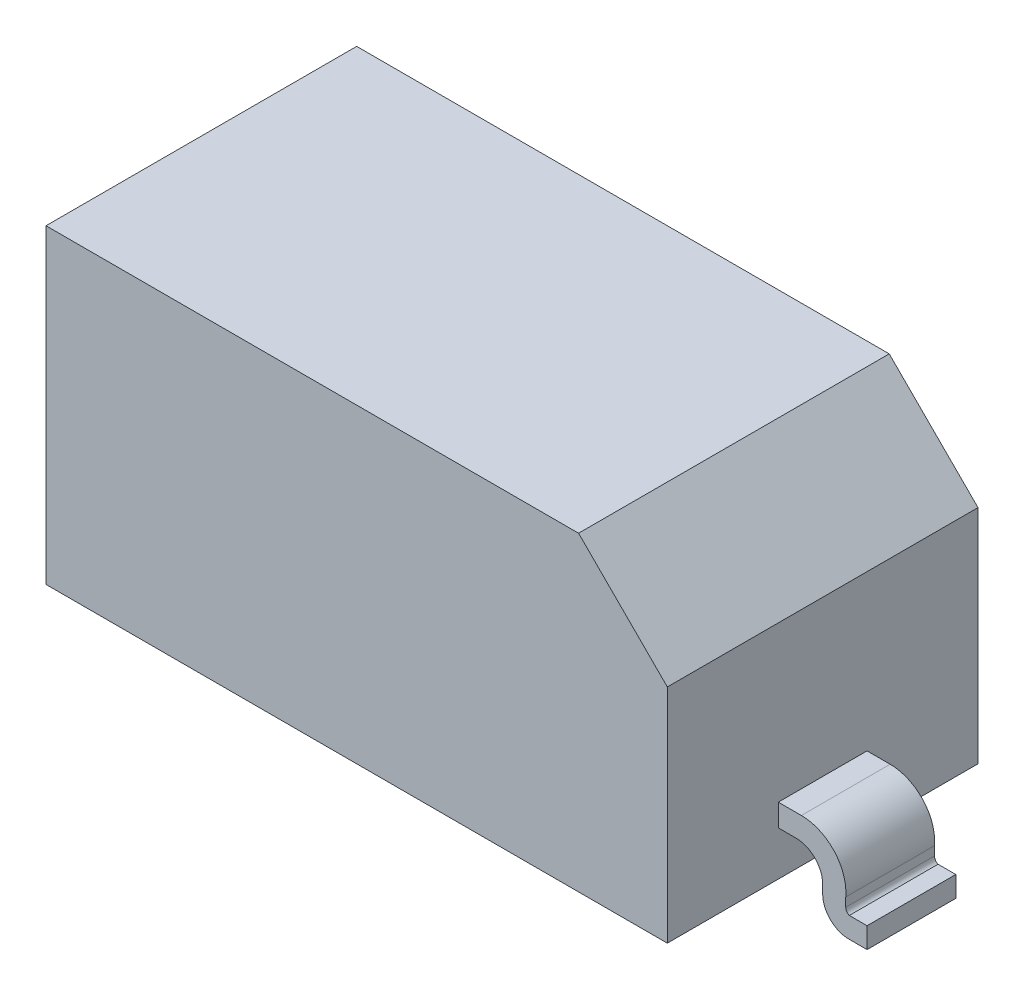
ISO-10303-21;
HEADER;
FILE_DESCRIPTION(('STEP AP214'),'2;1');
FILE_NAME('part.step','',(''),(''),'','','');
FILE_SCHEMA(('AUTOMOTIVE_DESIGN { 1 0 10303 214 1 1 1 1 }'));
ENDSEC;
DATA;
#1=APPLICATION_CONTEXT('core data for automotive mechanical design processes');
#2=APPLICATION_PROTOCOL_DEFINITION('international standard','automotive_design',2000,#1);
#3=PRODUCT_CONTEXT('',#1,'mechanical');
#4=PRODUCT('Part','Part','',(#3));
#5=PRODUCT_RELATED_PRODUCT_CATEGORY('part','',(#4));
#6=PRODUCT_DEFINITION_FORMATION('','',#4);
#7=PRODUCT_DEFINITION_CONTEXT('part definition',#1,'design');
#8=PRODUCT_DEFINITION('design','',#6,#7);
#9=PRODUCT_DEFINITION_SHAPE('','',#8);
#10=(LENGTH_UNIT() NAMED_UNIT(*) SI_UNIT(.MILLI.,.METRE.));
#11=(NAMED_UNIT(*) PLANE_ANGLE_UNIT() SI_UNIT($,.RADIAN.));
#12=(NAMED_UNIT(*) SI_UNIT($,.STERADIAN.) SOLID_ANGLE_UNIT());
#13=UNCERTAINTY_MEASURE_WITH_UNIT(LENGTH_MEASURE(1.E-05),#10,'distance_accuracy_value','');
#14=(GEOMETRIC_REPRESENTATION_CONTEXT(3) GLOBAL_UNCERTAINTY_ASSIGNED_CONTEXT((#13)) GLOBAL_UNIT_ASSIGNED_CONTEXT((#10,
#11,#12)) REPRESENTATION_CONTEXT('',''));
#15=CARTESIAN_POINT('',(0.,0.,0.));
#16=DIRECTION('',(0.,0.,1.));
#17=DIRECTION('',(1.,0.,0.));
#18=AXIS2_PLACEMENT_3D('',#15,#16,#17);
#19=CARTESIAN_POINT('',(-1.75,0.875,0.875));
#20=DIRECTION('',(1.,0.,0.));
#21=DIRECTION('',(0.,0.,-1.));
#22=AXIS2_PLACEMENT_3D('',#19,#20,#21);
#23=PLANE('',#22);
#24=DIRECTION('',(0.,-1.,0.));
#25=VECTOR('',#24,1.);
#26=CARTESIAN_POINT('',(-1.75,0.875,-0.875));
#27=LINE('',#26,#25);
#28=CARTESIAN_POINT('',(-1.75,0.875,-0.875));
#29=VERTEX_POINT('',#28);
#30=CARTESIAN_POINT('',(-1.75,-0.875,-0.875));
#31=VERTEX_POINT('',#30);
#32=EDGE_CURVE('E339',#29,#31,#27,.T.);
#33=ORIENTED_EDGE('',*,*,#32,.T.);
#34=DIRECTION('',(0.,0.,-1.));
#35=VECTOR('',#34,1.);
#36=CARTESIAN_POINT('',(-1.75,-0.875,0.875));
#37=LINE('',#36,#35);
#38=CARTESIAN_POINT('',(-1.75,-0.875,0.875));
#39=VERTEX_POINT('',#38);
#40=EDGE_CURVE('E11',#39,#31,#37,.T.);
#41=ORIENTED_EDGE('',*,*,#40,.F.);
#42=DIRECTION('',(0.,-1.,0.));
#43=VECTOR('',#42,1.);
#44=CARTESIAN_POINT('',(-1.75,0.875,0.875));
#45=LINE('',#44,#43);
#46=CARTESIAN_POINT('',(-1.75,0.875,0.875));
#47=VERTEX_POINT('',#46);
#48=EDGE_CURVE('E340',#47,#39,#45,.T.);
#49=ORIENTED_EDGE('',*,*,#48,.F.);
#50=DIRECTION('',(0.,0.,-1.));
#51=VECTOR('',#50,1.);
#52=CARTESIAN_POINT('',(-1.75,0.875,0.875));
#53=LINE('',#52,#51);
#54=EDGE_CURVE('E352',#47,#29,#53,.T.);
#55=ORIENTED_EDGE('',*,*,#54,.T.);
#56=EDGE_LOOP('',(#33,#41,#49,#55));
#57=FACE_BOUND('',#56,.T.);
#58=DIRECTION('',(0.,-1.,0.));
#59=VECTOR('',#58,1.);
#60=CARTESIAN_POINT('',(-1.75,-0.625,0.25));
#61=LINE('',#60,#59);
#62=CARTESIAN_POINT('',(-1.75,-0.49948491419278,0.25));
#63=VERTEX_POINT('',#62);
#64=CARTESIAN_POINT('',(-1.75,-0.625,0.25));
#65=VERTEX_POINT('',#64);
#66=EDGE_CURVE('E228',#63,#65,#61,.T.);
#67=ORIENTED_EDGE('',*,*,#66,.T.);
#68=DIRECTION('',(0.,0.,-1.));
#69=VECTOR('',#68,1.);
#70=CARTESIAN_POINT('',(-1.75,-0.625,0.25));
#71=LINE('',#70,#69);
#72=CARTESIAN_POINT('',(-1.75,-0.625,-0.25));
#73=VERTEX_POINT('',#72);
#74=EDGE_CURVE('E709',#65,#73,#71,.T.);
#75=ORIENTED_EDGE('',*,*,#74,.T.);
#76=DIRECTION('',(0.,-1.,0.));
#77=VECTOR('',#76,1.);
#78=CARTESIAN_POINT('',(-1.75,-0.625,-0.25));
#79=LINE('',#78,#77);
#80=CARTESIAN_POINT('',(-1.75,-0.499484914192779,-0.25));
#81=VERTEX_POINT('',#80);
#82=EDGE_CURVE('E249',#81,#73,#79,.T.);
#83=ORIENTED_EDGE('',*,*,#82,.F.);
#84=DIRECTION('',(0.,0.,-1.));
#85=VECTOR('',#84,1.);
#86=CARTESIAN_POINT('',(-1.75,-0.49948491419278,0.25));
#87=LINE('',#86,#85);
#88=EDGE_CURVE('E244',#63,#81,#87,.T.);
#89=ORIENTED_EDGE('',*,*,#88,.F.);
#90=EDGE_LOOP('',(#67,#75,#83,#89));
#91=FACE_BOUND('',#90,.T.);
#92=ADVANCED_FACE('F36',(#57,#91),#23,.F.);
#93=CARTESIAN_POINT('',(1.75,-0.874999999999999,0.875));
#94=DIRECTION('',(-1.,0.,0.));
#95=DIRECTION('',(0.,-1.,0.));
#96=AXIS2_PLACEMENT_3D('',#93,#94,#95);
#97=PLANE('',#96);
#98=DIRECTION('',(0.,1.,0.));
#99=VECTOR('',#98,1.);
#100=CARTESIAN_POINT('',(1.75,-0.874999999999999,-0.875));
#101=LINE('',#100,#99);
#102=CARTESIAN_POINT('',(1.75,-0.874999999999999,-0.875));
#103=VERTEX_POINT('',#102);
#104=CARTESIAN_POINT('',(1.75,0.375000000000001,-0.875));
#105=VERTEX_POINT('',#104);
#106=EDGE_CURVE('E357',#103,#105,#101,.T.);
#107=ORIENTED_EDGE('',*,*,#106,.T.);
#108=DIRECTION('',(0.,0.,-1.));
#109=VECTOR('',#108,1.);
#110=CARTESIAN_POINT('',(1.75,0.375000000000001,0.875));
#111=LINE('',#110,#109);
#112=CARTESIAN_POINT('',(1.75,0.375000000000001,0.875));
#113=VERTEX_POINT('',#112);
#114=EDGE_CURVE('E367',#113,#105,#111,.T.);
#115=ORIENTED_EDGE('',*,*,#114,.F.);
#116=DIRECTION('',(0.,1.,0.));
#117=VECTOR('',#116,1.);
#118=CARTESIAN_POINT('',(1.75,-0.874999999999999,0.875));
#119=LINE('',#118,#117);
#120=CARTESIAN_POINT('',(1.75,-0.874999999999999,0.875));
#121=VERTEX_POINT('',#120);
#122=EDGE_CURVE('E346',#121,#113,#119,.T.);
#123=ORIENTED_EDGE('',*,*,#122,.F.);
#124=DIRECTION('',(0.,0.,-1.));
#125=VECTOR('',#124,1.);
#126=CARTESIAN_POINT('',(1.75,-0.874999999999999,0.875));
#127=LINE('',#126,#125);
#128=EDGE_CURVE('E43',#121,#103,#127,.T.);
#129=ORIENTED_EDGE('',*,*,#128,.T.);
#130=EDGE_LOOP('',(#107,#115,#123,#129));
#131=FACE_BOUND('',#130,.T.);
#132=DIRECTION('',(0.,-1.,0.));
#133=VECTOR('',#132,1.);
#134=CARTESIAN_POINT('',(1.75,-0.625,0.25));
#135=LINE('',#134,#133);
#136=CARTESIAN_POINT('',(1.75,-0.49948491419278,0.25));
#137=VERTEX_POINT('',#136);
#138=CARTESIAN_POINT('',(1.75,-0.625,0.25));
#139=VERTEX_POINT('',#138);
#140=EDGE_CURVE('E259',#137,#139,#135,.T.);
#141=ORIENTED_EDGE('',*,*,#140,.F.);
#142=DIRECTION('',(0.,0.,-1.));
#143=VECTOR('',#142,1.);
#144=CARTESIAN_POINT('',(1.75,-0.49948491419278,0.25));
#145=LINE('',#144,#143);
#146=CARTESIAN_POINT('',(1.75,-0.49948491419278,-0.25));
#147=VERTEX_POINT('',#146);
#148=EDGE_CURVE('E284',#137,#147,#145,.T.);
#149=ORIENTED_EDGE('',*,*,#148,.T.);
#150=DIRECTION('',(0.,-1.,0.));
#151=VECTOR('',#150,1.);
#152=CARTESIAN_POINT('',(1.75,-0.625,-0.25));
#153=LINE('',#152,#151);
#154=CARTESIAN_POINT('',(1.75,-0.625,-0.25));
#155=VERTEX_POINT('',#154);
#156=EDGE_CURVE('E250',#147,#155,#153,.T.);
#157=ORIENTED_EDGE('',*,*,#156,.T.);
#158=DIRECTION('',(0.,0.,-1.));
#159=VECTOR('',#158,1.);
#160=CARTESIAN_POINT('',(1.75,-0.625,0.25));
#161=LINE('',#160,#159);
#162=EDGE_CURVE('E58',#139,#155,#161,.T.);
#163=ORIENTED_EDGE('',*,*,#162,.F.);
#164=EDGE_LOOP('',(#141,#149,#157,#163));
#165=FACE_BOUND('',#164,.T.);
#166=ADVANCED_FACE('F374',(#131,#165),#97,.F.);
#167=CARTESIAN_POINT('',(-1.75,-0.875,0.875));
#168=DIRECTION('',(0.,1.,0.));
#169=DIRECTION('',(-1.,0.,0.));
#170=AXIS2_PLACEMENT_3D('',#167,#168,#169);
#171=PLANE('',#170);
#172=DIRECTION('',(1.,0.,0.));
#173=VECTOR('',#172,1.);
#174=CARTESIAN_POINT('',(-1.75,-0.875,-0.875));
#175=LINE('',#174,#173);
#176=EDGE_CURVE('E355',#31,#103,#175,.T.);
#177=ORIENTED_EDGE('',*,*,#176,.T.);
#178=ORIENTED_EDGE('',*,*,#128,.F.);
#179=DIRECTION('',(1.,0.,0.));
#180=VECTOR('',#179,1.);
#181=CARTESIAN_POINT('',(-1.75,-0.875,0.875));
#182=LINE('',#181,#180);
#183=EDGE_CURVE('E343',#39,#121,#182,.T.);
#184=ORIENTED_EDGE('',*,*,#183,.F.);
#185=ORIENTED_EDGE('',*,*,#40,.T.);
#186=EDGE_LOOP('',(#177,#178,#184,#185));
#187=FACE_BOUND('',#186,.T.);
#188=ADVANCED_FACE('F395',(#187),#171,.F.);
#189=CARTESIAN_POINT('',(1.75,0.375000000000001,0.875));
#190=DIRECTION('',(-0.707106781186548,-0.707106781186547,0.));
#191=DIRECTION('',(0.707106781186547,-0.707106781186548,0.));
#192=AXIS2_PLACEMENT_3D('',#189,#190,#191);
#193=PLANE('',#192);
#194=DIRECTION('',(-0.707106781186547,0.707106781186548,0.));
#195=VECTOR('',#194,1.);
#196=CARTESIAN_POINT('',(1.75,0.375000000000001,-0.875));
#197=LINE('',#196,#195);
#198=CARTESIAN_POINT('',(1.25,0.875,-0.875));
#199=VERTEX_POINT('',#198);
#200=EDGE_CURVE('E359',#105,#199,#197,.T.);
#201=ORIENTED_EDGE('',*,*,#200,.T.);
#202=DIRECTION('',(0.,0.,-1.));
#203=VECTOR('',#202,1.);
#204=CARTESIAN_POINT('',(1.25,0.875,0.875));
#205=LINE('',#204,#203);
#206=CARTESIAN_POINT('',(1.25,0.875,0.875));
#207=VERTEX_POINT('',#206);
#208=EDGE_CURVE('E364',#207,#199,#205,.T.);
#209=ORIENTED_EDGE('',*,*,#208,.F.);
#210=DIRECTION('',(-0.707106781186547,0.707106781186548,0.));
#211=VECTOR('',#210,1.);
#212=CARTESIAN_POINT('',(1.75,0.375000000000001,0.875));
#213=LINE('',#212,#211);
#214=EDGE_CURVE('E348',#113,#207,#213,.T.);
#215=ORIENTED_EDGE('',*,*,#214,.F.);
#216=ORIENTED_EDGE('',*,*,#114,.T.);
#217=EDGE_LOOP('',(#201,#209,#215,#216));
#218=FACE_BOUND('',#217,.T.);
#219=ADVANCED_FACE('F385',(#218),#193,.F.);
#220=CARTESIAN_POINT('',(1.25,0.875,0.875));
#221=DIRECTION('',(0.,-1.,0.));
#222=DIRECTION('',(0.,0.,-1.));
#223=AXIS2_PLACEMENT_3D('',#220,#221,#222);
#224=PLANE('',#223);
#225=DIRECTION('',(-1.,0.,0.));
#226=VECTOR('',#225,1.);
#227=CARTESIAN_POINT('',(1.25,0.875,-0.875));
#228=LINE('',#227,#226);
#229=EDGE_CURVE('E344',#199,#29,#228,.T.);
#230=ORIENTED_EDGE('',*,*,#229,.T.);
#231=ORIENTED_EDGE('',*,*,#54,.F.);
#232=DIRECTION('',(-1.,0.,0.));
#233=VECTOR('',#232,1.);
#234=CARTESIAN_POINT('',(1.25,0.875,0.875));
#235=LINE('',#234,#233);
#236=EDGE_CURVE('E350',#207,#47,#235,.T.);
#237=ORIENTED_EDGE('',*,*,#236,.F.);
#238=ORIENTED_EDGE('',*,*,#208,.T.);
#239=EDGE_LOOP('',(#230,#231,#237,#238));
#240=FACE_BOUND('',#239,.T.);
#241=ADVANCED_FACE('F389',(#240),#224,.F.);
#242=CARTESIAN_POINT('',(-1.75,0.875,0.875));
#243=DIRECTION('',(0.,0.,-1.));
#244=DIRECTION('',(-1.,0.,0.));
#245=AXIS2_PLACEMENT_3D('',#242,#243,#244);
#246=PLANE('',#245);
#247=ORIENTED_EDGE('',*,*,#48,.T.);
#248=ORIENTED_EDGE('',*,*,#183,.T.);
#249=ORIENTED_EDGE('',*,*,#122,.T.);
#250=ORIENTED_EDGE('',*,*,#214,.T.);
#251=ORIENTED_EDGE('',*,*,#236,.T.);
#252=EDGE_LOOP('',(#247,#248,#249,#250,#251));
#253=FACE_BOUND('',#252,.T.);
#254=ADVANCED_FACE('F393',(#253),#246,.F.);
#255=CARTESIAN_POINT('',(-1.75,0.875,-0.875));
#256=DIRECTION('',(0.,0.,-1.));
#257=DIRECTION('',(-1.,0.,0.));
#258=AXIS2_PLACEMENT_3D('',#255,#256,#257);
#259=PLANE('',#258);
#260=ORIENTED_EDGE('',*,*,#32,.F.);
#261=ORIENTED_EDGE('',*,*,#229,.F.);
#262=ORIENTED_EDGE('',*,*,#200,.F.);
#263=ORIENTED_EDGE('',*,*,#106,.F.);
#264=ORIENTED_EDGE('',*,*,#176,.F.);
#265=EDGE_LOOP('',(#260,#261,#262,#263,#264));
#266=FACE_BOUND('',#265,.T.);
#267=ADVANCED_FACE('F381',(#266),#259,.T.);
#268=CARTESIAN_POINT('',(1.75,-0.625,0.25));
#269=DIRECTION('',(0.,1.,0.));
#270=DIRECTION('',(0.,0.,1.));
#271=AXIS2_PLACEMENT_3D('',#268,#269,#270);
#272=PLANE('',#271);
#273=DIRECTION('',(1.,0.,0.));
#274=VECTOR('',#273,1.);
#275=CARTESIAN_POINT('',(1.75,-0.625,-0.25));
#276=LINE('',#275,#274);
#277=CARTESIAN_POINT('',(1.85,-0.625,-0.25));
#278=VERTEX_POINT('',#277);
#279=EDGE_CURVE('E253',#155,#278,#276,.T.);
#280=ORIENTED_EDGE('',*,*,#279,.T.);
#281=DIRECTION('',(0.,0.,-1.));
#282=VECTOR('',#281,1.);
#283=CARTESIAN_POINT('',(1.85,-0.625,0.25));
#284=LINE('',#283,#282);
#285=CARTESIAN_POINT('',(1.85,-0.625,0.25));
#286=VERTEX_POINT('',#285);
#287=EDGE_CURVE('E335',#286,#278,#284,.T.);
#288=ORIENTED_EDGE('',*,*,#287,.F.);
#289=DIRECTION('',(1.,0.,0.));
#290=VECTOR('',#289,1.);
#291=CARTESIAN_POINT('',(1.75,-0.625,0.25));
#292=LINE('',#291,#290);
#293=EDGE_CURVE('E262',#139,#286,#292,.T.);
#294=ORIENTED_EDGE('',*,*,#293,.F.);
#295=ORIENTED_EDGE('',*,*,#162,.T.);
#296=EDGE_LOOP('',(#280,#288,#294,#295));
#297=FACE_BOUND('',#296,.T.);
#298=ADVANCED_FACE('F412',(#297),#272,.F.);
#299=CARTESIAN_POINT('',(1.85,-0.77503124674547,0.25));
#300=DIRECTION('',(0.,0.,-1.));
#301=DIRECTION('',(-1.,0.,0.));
#302=AXIS2_PLACEMENT_3D('',#299,#300,#301);
#303=CYLINDRICAL_SURFACE('',#302,0.15003124674547);
#304=CARTESIAN_POINT('',(1.85,-0.77503124674547,-0.25));
#305=DIRECTION('',(0.,0.,-1.));
#306=DIRECTION('',(-1.,0.,0.));
#307=AXIS2_PLACEMENT_3D('',#304,#305,#306);
#308=CIRCLE('',#307,0.15003124674547);
#309=CARTESIAN_POINT('',(2.,-0.771969384566991,-0.25));
#310=VERTEX_POINT('',#309);
#311=EDGE_CURVE('E287',#278,#310,#308,.T.);
#312=ORIENTED_EDGE('',*,*,#311,.T.);
#313=DIRECTION('',(0.,0.,-1.));
#314=VECTOR('',#313,1.);
#315=CARTESIAN_POINT('',(2.,-0.771969384566991,0.25));
#316=LINE('',#315,#314);
#317=CARTESIAN_POINT('',(2.,-0.771969384566991,0.25));
#318=VERTEX_POINT('',#317);
#319=EDGE_CURVE('E332',#318,#310,#316,.T.);
#320=ORIENTED_EDGE('',*,*,#319,.F.);
#321=CARTESIAN_POINT('',(1.85,-0.77503124674547,0.25));
#322=DIRECTION('',(0.,0.,-1.));
#323=DIRECTION('',(-1.,0.,0.));
#324=AXIS2_PLACEMENT_3D('',#321,#322,#323);
#325=CIRCLE('',#324,0.15003124674547);
#326=EDGE_CURVE('E265',#286,#318,#325,.T.);
#327=ORIENTED_EDGE('',*,*,#326,.F.);
#328=ORIENTED_EDGE('',*,*,#287,.T.);
#329=EDGE_LOOP('',(#312,#320,#327,#328));
#330=FACE_BOUND('',#329,.T.);
#331=ADVANCED_FACE('F417',(#330),#303,.F.);
#332=CARTESIAN_POINT('',(2.,-0.771969384566991,0.25));
#333=DIRECTION('',(1.,0.,0.));
#334=DIRECTION('',(0.,0.,-1.));
#335=AXIS2_PLACEMENT_3D('',#332,#333,#334);
#336=PLANE('',#335);
#337=DIRECTION('',(0.,-1.,0.));
#338=VECTOR('',#337,1.);
#339=CARTESIAN_POINT('',(2.,-0.771969384566991,-0.25));
#340=LINE('',#339,#338);
#341=CARTESIAN_POINT('',(2.,-0.821969384566991,-0.25));
#342=VERTEX_POINT('',#341);
#343=EDGE_CURVE('E289',#310,#342,#340,.T.);
#344=ORIENTED_EDGE('',*,*,#343,.T.);
#345=DIRECTION('',(0.,0.,-1.));
#346=VECTOR('',#345,1.);
#347=CARTESIAN_POINT('',(2.,-0.821969384566991,0.25));
#348=LINE('',#347,#346);
#349=CARTESIAN_POINT('',(2.,-0.821969384566991,0.25));
#350=VERTEX_POINT('',#349);
#351=EDGE_CURVE('E329',#350,#342,#348,.T.);
#352=ORIENTED_EDGE('',*,*,#351,.F.);
#353=DIRECTION('',(0.,-1.,0.));
#354=VECTOR('',#353,1.);
#355=CARTESIAN_POINT('',(2.,-0.771969384566991,0.25));
#356=LINE('',#355,#354);
#357=EDGE_CURVE('E267',#318,#350,#356,.T.);
#358=ORIENTED_EDGE('',*,*,#357,.F.);
#359=ORIENTED_EDGE('',*,*,#319,.T.);
#360=EDGE_LOOP('',(#344,#352,#358,#359));
#361=FACE_BOUND('',#360,.T.);
#362=ADVANCED_FACE('F420',(#361),#336,.F.);
#363=CARTESIAN_POINT('',(2.147,-0.821969384566991,0.25));
#364=DIRECTION('',(0.,0.,-1.));
#365=DIRECTION('',(-1.,0.,0.));
#366=AXIS2_PLACEMENT_3D('',#363,#364,#365);
#367=CYLINDRICAL_SURFACE('',#366,0.147);
#368=CARTESIAN_POINT('',(2.147,-0.821969384566991,-0.25));
#369=DIRECTION('',(0.,0.,1.));
#370=DIRECTION('',(1.,0.,0.));
#371=AXIS2_PLACEMENT_3D('',#368,#369,#370);
#372=CIRCLE('',#371,0.147);
#373=CARTESIAN_POINT('',(2.15,-0.968938769133981,-0.25));
#374=VERTEX_POINT('',#373);
#375=EDGE_CURVE('E291',#342,#374,#372,.T.);
#376=ORIENTED_EDGE('',*,*,#375,.T.);
#377=DIRECTION('',(0.,0.,-1.));
#378=VECTOR('',#377,1.);
#379=CARTESIAN_POINT('',(2.15,-0.968938769133981,0.25));
#380=LINE('',#379,#378);
#381=CARTESIAN_POINT('',(2.15,-0.968938769133981,0.25));
#382=VERTEX_POINT('',#381);
#383=EDGE_CURVE('E326',#382,#374,#380,.T.);
#384=ORIENTED_EDGE('',*,*,#383,.F.);
#385=CARTESIAN_POINT('',(2.147,-0.821969384566991,0.25));
#386=DIRECTION('',(0.,0.,1.));
#387=DIRECTION('',(1.,0.,0.));
#388=AXIS2_PLACEMENT_3D('',#385,#386,#387);
#389=CIRCLE('',#388,0.147);
#390=EDGE_CURVE('E269',#350,#382,#389,.T.);
#391=ORIENTED_EDGE('',*,*,#390,.F.);
#392=ORIENTED_EDGE('',*,*,#351,.T.);
#393=EDGE_LOOP('',(#376,#384,#391,#392));
#394=FACE_BOUND('',#393,.T.);
#395=ADVANCED_FACE('F424',(#394),#367,.T.);
#396=CARTESIAN_POINT('',(2.25,-0.968938769133981,0.25));
#397=DIRECTION('',(0.,1.,0.));
#398=DIRECTION('',(0.,0.,1.));
#399=AXIS2_PLACEMENT_3D('',#396,#397,#398);
#400=PLANE('',#399);
#401=DIRECTION('',(1.,0.,0.));
#402=VECTOR('',#401,1.);
#403=CARTESIAN_POINT('',(2.25,-0.968938769133981,-0.25));
#404=LINE('',#403,#402);
#405=CARTESIAN_POINT('',(2.25,-0.968938769133981,-0.25));
#406=VERTEX_POINT('',#405);
#407=EDGE_CURVE('E293',#374,#406,#404,.T.);
#408=ORIENTED_EDGE('',*,*,#407,.T.);
#409=DIRECTION('',(0.,0.,-1.));
#410=VECTOR('',#409,1.);
#411=CARTESIAN_POINT('',(2.25,-0.968938769133981,0.25));
#412=LINE('',#411,#410);
#413=CARTESIAN_POINT('',(2.25,-0.968938769133981,0.25));
#414=VERTEX_POINT('',#413);
#415=EDGE_CURVE('E323',#414,#406,#412,.T.);
#416=ORIENTED_EDGE('',*,*,#415,.F.);
#417=DIRECTION('',(1.,0.,0.));
#418=VECTOR('',#417,1.);
#419=CARTESIAN_POINT('',(2.25,-0.968938769133981,0.25));
#420=LINE('',#419,#418);
#421=EDGE_CURVE('E271',#382,#414,#420,.T.);
#422=ORIENTED_EDGE('',*,*,#421,.F.);
#423=ORIENTED_EDGE('',*,*,#383,.T.);
#424=EDGE_LOOP('',(#408,#416,#422,#423));
#425=FACE_BOUND('',#424,.T.);
#426=ADVANCED_FACE('F428',(#425),#400,.F.);
#427=CARTESIAN_POINT('',(2.25,-0.852248548132497,0.25));
#428=DIRECTION('',(-1.,0.,0.));
#429=DIRECTION('',(0.,0.,1.));
#430=AXIS2_PLACEMENT_3D('',#427,#428,#429);
#431=PLANE('',#430);
#432=DIRECTION('',(0.,1.,0.));
#433=VECTOR('',#432,1.);
#434=CARTESIAN_POINT('',(2.25,-0.852248548132497,-0.25));
#435=LINE('',#434,#433);
#436=CARTESIAN_POINT('',(2.25,-0.852248548132497,-0.25));
#437=VERTEX_POINT('',#436);
#438=EDGE_CURVE('E295',#406,#437,#435,.T.);
#439=ORIENTED_EDGE('',*,*,#438,.T.);
#440=DIRECTION('',(0.,0.,-1.));
#441=VECTOR('',#440,1.);
#442=CARTESIAN_POINT('',(2.25,-0.852248548132497,0.25));
#443=LINE('',#442,#441);
#444=CARTESIAN_POINT('',(2.25,-0.852248548132497,0.25));
#445=VERTEX_POINT('',#444);
#446=EDGE_CURVE('E320',#445,#437,#443,.T.);
#447=ORIENTED_EDGE('',*,*,#446,.F.);
#448=DIRECTION('',(0.,1.,0.));
#449=VECTOR('',#448,1.);
#450=CARTESIAN_POINT('',(2.25,-0.852248548132497,0.25));
#451=LINE('',#450,#449);
#452=EDGE_CURVE('E273',#414,#445,#451,.T.);
#453=ORIENTED_EDGE('',*,*,#452,.F.);
#454=ORIENTED_EDGE('',*,*,#415,.T.);
#455=EDGE_LOOP('',(#439,#447,#453,#454));
#456=FACE_BOUND('',#455,.T.);
#457=ADVANCED_FACE('F432',(#456),#431,.F.);
#458=CARTESIAN_POINT('',(2.15,-0.852248548132497,0.25));
#459=DIRECTION('',(0.,-1.,0.));
#460=DIRECTION('',(0.,0.,-1.));
#461=AXIS2_PLACEMENT_3D('',#458,#459,#460);
#462=PLANE('',#461);
#463=DIRECTION('',(-1.,0.,0.));
#464=VECTOR('',#463,1.);
#465=CARTESIAN_POINT('',(2.15,-0.852248548132497,-0.25));
#466=LINE('',#465,#464);
#467=CARTESIAN_POINT('',(2.15,-0.852248548132497,-0.25));
#468=VERTEX_POINT('',#467);
#469=EDGE_CURVE('E297',#437,#468,#466,.T.);
#470=ORIENTED_EDGE('',*,*,#469,.T.);
#471=DIRECTION('',(0.,0.,-1.));
#472=VECTOR('',#471,1.);
#473=CARTESIAN_POINT('',(2.15,-0.852248548132497,0.25));
#474=LINE('',#473,#472);
#475=CARTESIAN_POINT('',(2.15,-0.852248548132497,0.25));
#476=VERTEX_POINT('',#475);
#477=EDGE_CURVE('E317',#476,#468,#474,.T.);
#478=ORIENTED_EDGE('',*,*,#477,.F.);
#479=DIRECTION('',(-1.,0.,0.));
#480=VECTOR('',#479,1.);
#481=CARTESIAN_POINT('',(2.15,-0.852248548132497,0.25));
#482=LINE('',#481,#480);
#483=EDGE_CURVE('E275',#445,#476,#482,.T.);
#484=ORIENTED_EDGE('',*,*,#483,.F.);
#485=ORIENTED_EDGE('',*,*,#446,.T.);
#486=EDGE_LOOP('',(#470,#478,#484,#485));
#487=FACE_BOUND('',#486,.T.);
#488=ADVANCED_FACE('F436',(#487),#462,.F.);
#489=CARTESIAN_POINT('',(2.1625,-0.822248548132497,0.25));
#490=DIRECTION('',(0.,0.,-1.));
#491=DIRECTION('',(-1.,0.,0.));
#492=AXIS2_PLACEMENT_3D('',#489,#490,#491);
#493=CYLINDRICAL_SURFACE('',#492,0.0324999999999995);
#494=CARTESIAN_POINT('',(2.1625,-0.822248548132497,-0.25));
#495=DIRECTION('',(0.,0.,-1.));
#496=DIRECTION('',(1.,0.,0.));
#497=AXIS2_PLACEMENT_3D('',#494,#495,#496);
#498=CIRCLE('',#497,0.0324999999999995);
#499=CARTESIAN_POINT('',(2.13,-0.822248548132497,-0.25));
#500=VERTEX_POINT('',#499);
#501=EDGE_CURVE('E299',#468,#500,#498,.T.);
#502=ORIENTED_EDGE('',*,*,#501,.T.);
#503=DIRECTION('',(0.,0.,-1.));
#504=VECTOR('',#503,1.);
#505=CARTESIAN_POINT('',(2.13,-0.822248548132497,0.25));
#506=LINE('',#505,#504);
#507=CARTESIAN_POINT('',(2.13,-0.822248548132497,0.25));
#508=VERTEX_POINT('',#507);
#509=EDGE_CURVE('E314',#508,#500,#506,.T.);
#510=ORIENTED_EDGE('',*,*,#509,.F.);
#511=CARTESIAN_POINT('',(2.1625,-0.822248548132497,0.25));
#512=DIRECTION('',(0.,0.,-1.));
#513=DIRECTION('',(1.,0.,0.));
#514=AXIS2_PLACEMENT_3D('',#511,#512,#513);
#515=CIRCLE('',#514,0.0324999999999995);
#516=EDGE_CURVE('E277',#476,#508,#515,.T.);
#517=ORIENTED_EDGE('',*,*,#516,.F.);
#518=ORIENTED_EDGE('',*,*,#477,.T.);
#519=EDGE_LOOP('',(#502,#510,#517,#518));
#520=FACE_BOUND('',#519,.T.);
#521=ADVANCED_FACE('F440',(#520),#493,.F.);
#522=CARTESIAN_POINT('',(2.13,-0.772248548132497,0.25));
#523=DIRECTION('',(-1.,0.,0.));
#524=DIRECTION('',(0.,0.,1.));
#525=AXIS2_PLACEMENT_3D('',#522,#523,#524);
#526=PLANE('',#525);
#527=DIRECTION('',(0.,1.,0.));
#528=VECTOR('',#527,1.);
#529=CARTESIAN_POINT('',(2.13,-0.772248548132497,-0.25));
#530=LINE('',#529,#528);
#531=CARTESIAN_POINT('',(2.13,-0.772248548132497,-0.25));
#532=VERTEX_POINT('',#531);
#533=EDGE_CURVE('E301',#500,#532,#530,.T.);
#534=ORIENTED_EDGE('',*,*,#533,.T.);
#535=DIRECTION('',(0.,0.,-1.));
#536=VECTOR('',#535,1.);
#537=CARTESIAN_POINT('',(2.13,-0.772248548132497,0.25));
#538=LINE('',#537,#536);
#539=CARTESIAN_POINT('',(2.13,-0.772248548132497,0.25));
#540=VERTEX_POINT('',#539);
#541=EDGE_CURVE('E311',#540,#532,#538,.T.);
#542=ORIENTED_EDGE('',*,*,#541,.F.);
#543=DIRECTION('',(0.,1.,0.));
#544=VECTOR('',#543,1.);
#545=CARTESIAN_POINT('',(2.13,-0.772248548132497,0.25));
#546=LINE('',#545,#544);
#547=EDGE_CURVE('E279',#508,#540,#546,.T.);
#548=ORIENTED_EDGE('',*,*,#547,.F.);
#549=ORIENTED_EDGE('',*,*,#509,.T.);
#550=EDGE_LOOP('',(#534,#542,#548,#549));
#551=FACE_BOUND('',#550,.T.);
#552=ADVANCED_FACE('F444',(#551),#526,.F.);
#553=CARTESIAN_POINT('',(1.88,-0.75043478977307,0.25));
#554=DIRECTION('',(0.,0.,-1.));
#555=DIRECTION('',(-1.,0.,0.));
#556=AXIS2_PLACEMENT_3D('',#553,#554,#555);
#557=CYLINDRICAL_SURFACE('',#556,0.250949875580291);
#558=CARTESIAN_POINT('',(1.88,-0.75043478977307,-0.25));
#559=DIRECTION('',(0.,0.,1.));
#560=DIRECTION('',(-1.,0.,0.));
#561=AXIS2_PLACEMENT_3D('',#558,#559,#560);
#562=CIRCLE('',#561,0.250949875580291);
#563=CARTESIAN_POINT('',(1.88,-0.49948491419278,-0.25));
#564=VERTEX_POINT('',#563);
#565=EDGE_CURVE('E303',#532,#564,#562,.T.);
#566=ORIENTED_EDGE('',*,*,#565,.T.);
#567=DIRECTION('',(0.,0.,-1.));
#568=VECTOR('',#567,1.);
#569=CARTESIAN_POINT('',(1.88,-0.49948491419278,0.25));
#570=LINE('',#569,#568);
#571=CARTESIAN_POINT('',(1.88,-0.49948491419278,0.25));
#572=VERTEX_POINT('',#571);
#573=EDGE_CURVE('E308',#572,#564,#570,.T.);
#574=ORIENTED_EDGE('',*,*,#573,.F.);
#575=CARTESIAN_POINT('',(1.88,-0.75043478977307,0.25));
#576=DIRECTION('',(0.,0.,1.));
#577=DIRECTION('',(-1.,0.,0.));
#578=AXIS2_PLACEMENT_3D('',#575,#576,#577);
#579=CIRCLE('',#578,0.250949875580291);
#580=EDGE_CURVE('E281',#540,#572,#579,.T.);
#581=ORIENTED_EDGE('',*,*,#580,.F.);
#582=ORIENTED_EDGE('',*,*,#541,.T.);
#583=EDGE_LOOP('',(#566,#574,#581,#582));
#584=FACE_BOUND('',#583,.T.);
#585=ADVANCED_FACE('F448',(#584),#557,.T.);
#586=CARTESIAN_POINT('',(1.75,-0.49948491419278,0.25));
#587=DIRECTION('',(0.,-1.,0.));
#588=DIRECTION('',(0.,0.,-1.));
#589=AXIS2_PLACEMENT_3D('',#586,#587,#588);
#590=PLANE('',#589);
#591=DIRECTION('',(-1.,0.,0.));
#592=VECTOR('',#591,1.);
#593=CARTESIAN_POINT('',(1.75,-0.49948491419278,-0.25));
#594=LINE('',#593,#592);
#595=EDGE_CURVE('E263',#564,#147,#594,.T.);
#596=ORIENTED_EDGE('',*,*,#595,.T.);
#597=ORIENTED_EDGE('',*,*,#148,.F.);
#598=DIRECTION('',(-1.,0.,0.));
#599=VECTOR('',#598,1.);
#600=CARTESIAN_POINT('',(1.75,-0.49948491419278,0.25));
#601=LINE('',#600,#599);
#602=EDGE_CURVE('E283',#572,#137,#601,.T.);
#603=ORIENTED_EDGE('',*,*,#602,.F.);
#604=ORIENTED_EDGE('',*,*,#573,.T.);
#605=EDGE_LOOP('',(#596,#597,#603,#604));
#606=FACE_BOUND('',#605,.T.);
#607=ADVANCED_FACE('F452',(#606),#590,.F.);
#608=CARTESIAN_POINT('',(1.88,-0.75043478977307,0.25));
#609=DIRECTION('',(0.,0.,-1.));
#610=DIRECTION('',(-1.,0.,0.));
#611=AXIS2_PLACEMENT_3D('',#608,#609,#610);
#612=PLANE('',#611);
#613=ORIENTED_EDGE('',*,*,#140,.T.);
#614=ORIENTED_EDGE('',*,*,#293,.T.);
#615=ORIENTED_EDGE('',*,*,#326,.T.);
#616=ORIENTED_EDGE('',*,*,#357,.T.);
#617=ORIENTED_EDGE('',*,*,#390,.T.);
#618=ORIENTED_EDGE('',*,*,#421,.T.);
#619=ORIENTED_EDGE('',*,*,#452,.T.);
#620=ORIENTED_EDGE('',*,*,#483,.T.);
#621=ORIENTED_EDGE('',*,*,#516,.T.);
#622=ORIENTED_EDGE('',*,*,#547,.T.);
#623=ORIENTED_EDGE('',*,*,#580,.T.);
#624=ORIENTED_EDGE('',*,*,#602,.T.);
#625=EDGE_LOOP('',(#613,#614,#615,#616,#617,#618,#619,#620,#621,#622,#623,#624));
#626=FACE_BOUND('',#625,.T.);
#627=ADVANCED_FACE('F456',(#626),#612,.F.);
#628=CARTESIAN_POINT('',(1.88,-0.75043478977307,-0.25));
#629=DIRECTION('',(0.,0.,-1.));
#630=DIRECTION('',(-1.,0.,0.));
#631=AXIS2_PLACEMENT_3D('',#628,#629,#630);
#632=PLANE('',#631);
#633=ORIENTED_EDGE('',*,*,#156,.F.);
#634=ORIENTED_EDGE('',*,*,#595,.F.);
#635=ORIENTED_EDGE('',*,*,#565,.F.);
#636=ORIENTED_EDGE('',*,*,#533,.F.);
#637=ORIENTED_EDGE('',*,*,#501,.F.);
#638=ORIENTED_EDGE('',*,*,#469,.F.);
#639=ORIENTED_EDGE('',*,*,#438,.F.);
#640=ORIENTED_EDGE('',*,*,#407,.F.);
#641=ORIENTED_EDGE('',*,*,#375,.F.);
#642=ORIENTED_EDGE('',*,*,#343,.F.);
#643=ORIENTED_EDGE('',*,*,#311,.F.);
#644=ORIENTED_EDGE('',*,*,#279,.F.);
#645=EDGE_LOOP('',(#633,#634,#635,#636,#637,#638,#639,#640,#641,#642,#643,#644));
#646=FACE_BOUND('',#645,.T.);
#647=ADVANCED_FACE('F458',(#646),#632,.T.);
#648=CARTESIAN_POINT('',(-1.75,-0.49948491419278,0.25));
#649=DIRECTION('',(0.,1.,0.));
#650=DIRECTION('',(0.,0.,1.));
#651=AXIS2_PLACEMENT_3D('',#648,#649,#650);
#652=PLANE('',#651);
#653=DIRECTION('',(1.,0.,0.));
#654=VECTOR('',#653,1.);
#655=CARTESIAN_POINT('',(-1.75,-0.49948491419278,-0.25));
#656=LINE('',#655,#654);
#657=CARTESIAN_POINT('',(-1.88,-0.49948491419278,-0.25));
#658=VERTEX_POINT('',#657);
#659=EDGE_CURVE('E50',#658,#81,#656,.T.);
#660=ORIENTED_EDGE('',*,*,#659,.F.);
#661=DIRECTION('',(0.,0.,-1.));
#662=VECTOR('',#661,1.);
#663=CARTESIAN_POINT('',(-1.88,-0.49948491419278,0.25));
#664=LINE('',#663,#662);
#665=CARTESIAN_POINT('',(-1.88,-0.49948491419278,0.25));
#666=VERTEX_POINT('',#665);
#667=EDGE_CURVE('E246',#666,#658,#664,.T.);
#668=ORIENTED_EDGE('',*,*,#667,.F.);
#669=DIRECTION('',(1.,0.,0.));
#670=VECTOR('',#669,1.);
#671=CARTESIAN_POINT('',(-1.75,-0.49948491419278,0.25));
#672=LINE('',#671,#670);
#673=EDGE_CURVE('E232',#666,#63,#672,.T.);
#674=ORIENTED_EDGE('',*,*,#673,.T.);
#675=ORIENTED_EDGE('',*,*,#88,.T.);
#676=EDGE_LOOP('',(#660,#668,#674,#675));
#677=FACE_BOUND('',#676,.T.);
#678=ADVANCED_FACE('F243',(#677),#652,.T.);
#679=CARTESIAN_POINT('',(-1.88,-0.75043478977307,0.25));
#680=DIRECTION('',(0.,0.,-1.));
#681=DIRECTION('',(-1.,0.,0.));
#682=AXIS2_PLACEMENT_3D('',#679,#680,#681);
#683=CYLINDRICAL_SURFACE('',#682,0.250949875580291);
#684=CARTESIAN_POINT('',(-1.88,-0.75043478977307,-0.25));
#685=DIRECTION('',(0.,0.,-1.));
#686=DIRECTION('',(1.,0.,0.));
#687=AXIS2_PLACEMENT_3D('',#684,#685,#686);
#688=CIRCLE('',#687,0.250949875580291);
#689=CARTESIAN_POINT('',(-2.13,-0.772248548132497,-0.25));
#690=VERTEX_POINT('',#689);
#691=EDGE_CURVE('E741',#690,#658,#688,.T.);
#692=ORIENTED_EDGE('',*,*,#691,.F.);
#693=DIRECTION('',(0.,0.,-1.));
#694=VECTOR('',#693,1.);
#695=CARTESIAN_POINT('',(-2.13,-0.772248548132497,0.25));
#696=LINE('',#695,#694);
#697=CARTESIAN_POINT('',(-2.13,-0.772248548132497,0.25));
#698=VERTEX_POINT('',#697);
#699=EDGE_CURVE('E255',#698,#690,#696,.T.);
#700=ORIENTED_EDGE('',*,*,#699,.F.);
#701=CARTESIAN_POINT('',(-1.88,-0.75043478977307,0.25));
#702=DIRECTION('',(0.,0.,-1.));
#703=DIRECTION('',(1.,0.,0.));
#704=AXIS2_PLACEMENT_3D('',#701,#702,#703);
#705=CIRCLE('',#704,0.250949875580291);
#706=EDGE_CURVE('E247',#698,#666,#705,.T.);
#707=ORIENTED_EDGE('',*,*,#706,.T.);
#708=ORIENTED_EDGE('',*,*,#667,.T.);
#709=EDGE_LOOP('',(#692,#700,#707,#708));
#710=FACE_BOUND('',#709,.T.);
#711=ADVANCED_FACE('F467',(#710),#683,.T.);
#712=CARTESIAN_POINT('',(-2.13,-0.772248548132497,0.25));
#713=DIRECTION('',(-1.,0.,0.));
#714=DIRECTION('',(0.,0.,1.));
#715=AXIS2_PLACEMENT_3D('',#712,#713,#714);
#716=PLANE('',#715);
#717=DIRECTION('',(0.,1.,0.));
#718=VECTOR('',#717,1.);
#719=CARTESIAN_POINT('',(-2.13,-0.772248548132497,-0.25));
#720=LINE('',#719,#718);
#721=CARTESIAN_POINT('',(-2.13,-0.822248548132497,-0.25));
#722=VERTEX_POINT('',#721);
#723=EDGE_CURVE('E737',#722,#690,#720,.T.);
#724=ORIENTED_EDGE('',*,*,#723,.F.);
#725=DIRECTION('',(0.,0.,-1.));
#726=VECTOR('',#725,1.);
#727=CARTESIAN_POINT('',(-2.13,-0.822248548132497,0.25));
#728=LINE('',#727,#726);
#729=CARTESIAN_POINT('',(-2.13,-0.822248548132497,0.25));
#730=VERTEX_POINT('',#729);
#731=EDGE_CURVE('E732',#730,#722,#728,.T.);
#732=ORIENTED_EDGE('',*,*,#731,.F.);
#733=DIRECTION('',(0.,1.,0.));
#734=VECTOR('',#733,1.);
#735=CARTESIAN_POINT('',(-2.13,-0.772248548132497,0.25));
#736=LINE('',#735,#734);
#737=EDGE_CURVE('E740',#730,#698,#736,.T.);
#738=ORIENTED_EDGE('',*,*,#737,.T.);
#739=ORIENTED_EDGE('',*,*,#699,.T.);
#740=EDGE_LOOP('',(#724,#732,#738,#739));
#741=FACE_BOUND('',#740,.T.);
#742=ADVANCED_FACE('F470',(#741),#716,.T.);
#743=CARTESIAN_POINT('',(-2.1625,-0.822248548132497,0.25));
#744=DIRECTION('',(0.,0.,-1.));
#745=DIRECTION('',(-1.,0.,0.));
#746=AXIS2_PLACEMENT_3D('',#743,#744,#745);
#747=CYLINDRICAL_SURFACE('',#746,0.0324999999999995);
#748=CARTESIAN_POINT('',(-2.1625,-0.822248548132497,-0.25));
#749=DIRECTION('',(0.,0.,1.));
#750=DIRECTION('',(-1.,0.,0.));
#751=AXIS2_PLACEMENT_3D('',#748,#749,#750);
#752=CIRCLE('',#751,0.0324999999999995);
#753=CARTESIAN_POINT('',(-2.15,-0.852248548132497,-0.25));
#754=VERTEX_POINT('',#753);
#755=EDGE_CURVE('E745',#754,#722,#752,.T.);
#756=ORIENTED_EDGE('',*,*,#755,.F.);
#757=DIRECTION('',(0.,0.,-1.));
#758=VECTOR('',#757,1.);
#759=CARTESIAN_POINT('',(-2.15,-0.852248548132497,0.25));
#760=LINE('',#759,#758);
#761=CARTESIAN_POINT('',(-2.15,-0.852248548132497,0.25));
#762=VERTEX_POINT('',#761);
#763=EDGE_CURVE('E730',#762,#754,#760,.T.);
#764=ORIENTED_EDGE('',*,*,#763,.F.);
#765=CARTESIAN_POINT('',(-2.1625,-0.822248548132497,0.25));
#766=DIRECTION('',(0.,0.,1.));
#767=DIRECTION('',(-1.,0.,0.));
#768=AXIS2_PLACEMENT_3D('',#765,#766,#767);
#769=CIRCLE('',#768,0.0324999999999995);
#770=EDGE_CURVE('E785',#762,#730,#769,.T.);
#771=ORIENTED_EDGE('',*,*,#770,.T.);
#772=ORIENTED_EDGE('',*,*,#731,.T.);
#773=EDGE_LOOP('',(#756,#764,#771,#772));
#774=FACE_BOUND('',#773,.T.);
#775=ADVANCED_FACE('F474',(#774),#747,.F.);
#776=CARTESIAN_POINT('',(-2.15,-0.852248548132497,0.25));
#777=DIRECTION('',(0.,1.,0.));
#778=DIRECTION('',(0.,0.,1.));
#779=AXIS2_PLACEMENT_3D('',#776,#777,#778);
#780=PLANE('',#779);
#781=DIRECTION('',(1.,0.,0.));
#782=VECTOR('',#781,1.);
#783=CARTESIAN_POINT('',(-2.15,-0.852248548132497,-0.25));
#784=LINE('',#783,#782);
#785=CARTESIAN_POINT('',(-2.25,-0.852248548132497,-0.25));
#786=VERTEX_POINT('',#785);
#787=EDGE_CURVE('E747',#786,#754,#784,.T.);
#788=ORIENTED_EDGE('',*,*,#787,.F.);
#789=DIRECTION('',(0.,0.,-1.));
#790=VECTOR('',#789,1.);
#791=CARTESIAN_POINT('',(-2.25,-0.852248548132497,0.25));
#792=LINE('',#791,#790);
#793=CARTESIAN_POINT('',(-2.25,-0.852248548132497,0.25));
#794=VERTEX_POINT('',#793);
#795=EDGE_CURVE('E728',#794,#786,#792,.T.);
#796=ORIENTED_EDGE('',*,*,#795,.F.);
#797=DIRECTION('',(1.,0.,0.));
#798=VECTOR('',#797,1.);
#799=CARTESIAN_POINT('',(-2.15,-0.852248548132497,0.25));
#800=LINE('',#799,#798);
#801=EDGE_CURVE('E782',#794,#762,#800,.T.);
#802=ORIENTED_EDGE('',*,*,#801,.T.);
#803=ORIENTED_EDGE('',*,*,#763,.T.);
#804=EDGE_LOOP('',(#788,#796,#802,#803));
#805=FACE_BOUND('',#804,.T.);
#806=ADVANCED_FACE('F478',(#805),#780,.T.);
#807=CARTESIAN_POINT('',(-2.25,-0.852248548132497,0.25));
#808=DIRECTION('',(-1.,0.,0.));
#809=DIRECTION('',(0.,0.,1.));
#810=AXIS2_PLACEMENT_3D('',#807,#808,#809);
#811=PLANE('',#810);
#812=DIRECTION('',(0.,1.,0.));
#813=VECTOR('',#812,1.);
#814=CARTESIAN_POINT('',(-2.25,-0.852248548132497,-0.25));
#815=LINE('',#814,#813);
#816=CARTESIAN_POINT('',(-2.25,-0.968938769133981,-0.25));
#817=VERTEX_POINT('',#816);
#818=EDGE_CURVE('E752',#817,#786,#815,.T.);
#819=ORIENTED_EDGE('',*,*,#818,.F.);
#820=DIRECTION('',(0.,0.,-1.));
#821=VECTOR('',#820,1.);
#822=CARTESIAN_POINT('',(-2.25,-0.968938769133981,0.25));
#823=LINE('',#822,#821);
#824=CARTESIAN_POINT('',(-2.25,-0.968938769133981,0.25));
#825=VERTEX_POINT('',#824);
#826=EDGE_CURVE('E726',#825,#817,#823,.T.);
#827=ORIENTED_EDGE('',*,*,#826,.F.);
#828=DIRECTION('',(0.,1.,0.));
#829=VECTOR('',#828,1.);
#830=CARTESIAN_POINT('',(-2.25,-0.852248548132497,0.25));
#831=LINE('',#830,#829);
#832=EDGE_CURVE('E779',#825,#794,#831,.T.);
#833=ORIENTED_EDGE('',*,*,#832,.T.);
#834=ORIENTED_EDGE('',*,*,#795,.T.);
#835=EDGE_LOOP('',(#819,#827,#833,#834));
#836=FACE_BOUND('',#835,.T.);
#837=ADVANCED_FACE('F482',(#836),#811,.T.);
#838=CARTESIAN_POINT('',(-2.25,-0.968938769133981,0.25));
#839=DIRECTION('',(0.,-1.,0.));
#840=DIRECTION('',(0.,0.,-1.));
#841=AXIS2_PLACEMENT_3D('',#838,#839,#840);
#842=PLANE('',#841);
#843=DIRECTION('',(-1.,0.,0.));
#844=VECTOR('',#843,1.);
#845=CARTESIAN_POINT('',(-2.25,-0.968938769133981,-0.25));
#846=LINE('',#845,#844);
#847=CARTESIAN_POINT('',(-2.15,-0.968938769133981,-0.25));
#848=VERTEX_POINT('',#847);
#849=EDGE_CURVE('E755',#848,#817,#846,.T.);
#850=ORIENTED_EDGE('',*,*,#849,.F.);
#851=DIRECTION('',(0.,0.,-1.));
#852=VECTOR('',#851,1.);
#853=CARTESIAN_POINT('',(-2.15,-0.968938769133981,0.25));
#854=LINE('',#853,#852);
#855=CARTESIAN_POINT('',(-2.15,-0.968938769133981,0.25));
#856=VERTEX_POINT('',#855);
#857=EDGE_CURVE('E724',#856,#848,#854,.T.);
#858=ORIENTED_EDGE('',*,*,#857,.F.);
#859=DIRECTION('',(-1.,0.,0.));
#860=VECTOR('',#859,1.);
#861=CARTESIAN_POINT('',(-2.25,-0.968938769133981,0.25));
#862=LINE('',#861,#860);
#863=EDGE_CURVE('E775',#856,#825,#862,.T.);
#864=ORIENTED_EDGE('',*,*,#863,.T.);
#865=ORIENTED_EDGE('',*,*,#826,.T.);
#866=EDGE_LOOP('',(#850,#858,#864,#865));
#867=FACE_BOUND('',#866,.T.);
#868=ADVANCED_FACE('F486',(#867),#842,.T.);
#869=CARTESIAN_POINT('',(-2.147,-0.821969384566991,0.25));
#870=DIRECTION('',(0.,0.,-1.));
#871=DIRECTION('',(-1.,0.,0.));
#872=AXIS2_PLACEMENT_3D('',#869,#870,#871);
#873=CYLINDRICAL_SURFACE('',#872,0.147);
#874=CARTESIAN_POINT('',(-2.147,-0.821969384566991,-0.25));
#875=DIRECTION('',(0.,0.,-1.));
#876=DIRECTION('',(-1.,0.,0.));
#877=AXIS2_PLACEMENT_3D('',#874,#875,#876);
#878=CIRCLE('',#877,0.147);
#879=CARTESIAN_POINT('',(-2.,-0.821969384566991,-0.25));
#880=VERTEX_POINT('',#879);
#881=EDGE_CURVE('E758',#880,#848,#878,.T.);
#882=ORIENTED_EDGE('',*,*,#881,.F.);
#883=DIRECTION('',(0.,0.,-1.));
#884=VECTOR('',#883,1.);
#885=CARTESIAN_POINT('',(-2.,-0.821969384566991,0.25));
#886=LINE('',#885,#884);
#887=CARTESIAN_POINT('',(-2.,-0.821969384566991,0.25));
#888=VERTEX_POINT('',#887);
#889=EDGE_CURVE('E722',#888,#880,#886,.T.);
#890=ORIENTED_EDGE('',*,*,#889,.F.);
#891=CARTESIAN_POINT('',(-2.147,-0.821969384566991,0.25));
#892=DIRECTION('',(0.,0.,-1.));
#893=DIRECTION('',(-1.,0.,0.));
#894=AXIS2_PLACEMENT_3D('',#891,#892,#893);
#895=CIRCLE('',#894,0.147);
#896=EDGE_CURVE('E793',#888,#856,#895,.T.);
#897=ORIENTED_EDGE('',*,*,#896,.T.);
#898=ORIENTED_EDGE('',*,*,#857,.T.);
#899=EDGE_LOOP('',(#882,#890,#897,#898));
#900=FACE_BOUND('',#899,.T.);
#901=ADVANCED_FACE('F490',(#900),#873,.T.);
#902=CARTESIAN_POINT('',(-2.,-0.771969384566991,0.25));
#903=DIRECTION('',(1.,0.,0.));
#904=DIRECTION('',(0.,0.,-1.));
#905=AXIS2_PLACEMENT_3D('',#902,#903,#904);
#906=PLANE('',#905);
#907=DIRECTION('',(0.,-1.,0.));
#908=VECTOR('',#907,1.);
#909=CARTESIAN_POINT('',(-2.,-0.771969384566991,-0.25));
#910=LINE('',#909,#908);
#911=CARTESIAN_POINT('',(-2.,-0.771969384566991,-0.25));
#912=VERTEX_POINT('',#911);
#913=EDGE_CURVE('E761',#912,#880,#910,.T.);
#914=ORIENTED_EDGE('',*,*,#913,.F.);
#915=DIRECTION('',(0.,0.,-1.));
#916=VECTOR('',#915,1.);
#917=CARTESIAN_POINT('',(-2.,-0.771969384566991,0.25));
#918=LINE('',#917,#916);
#919=CARTESIAN_POINT('',(-2.,-0.771969384566991,0.25));
#920=VERTEX_POINT('',#919);
#921=EDGE_CURVE('E715',#920,#912,#918,.T.);
#922=ORIENTED_EDGE('',*,*,#921,.F.);
#923=DIRECTION('',(0.,-1.,0.));
#924=VECTOR('',#923,1.);
#925=CARTESIAN_POINT('',(-2.,-0.771969384566991,0.25));
#926=LINE('',#925,#924);
#927=EDGE_CURVE('E768',#920,#888,#926,.T.);
#928=ORIENTED_EDGE('',*,*,#927,.T.);
#929=ORIENTED_EDGE('',*,*,#889,.T.);
#930=EDGE_LOOP('',(#914,#922,#928,#929));
#931=FACE_BOUND('',#930,.T.);
#932=ADVANCED_FACE('F494',(#931),#906,.T.);
#933=CARTESIAN_POINT('',(-1.85,-0.77503124674547,0.25));
#934=DIRECTION('',(0.,0.,-1.));
#935=DIRECTION('',(-1.,0.,0.));
#936=AXIS2_PLACEMENT_3D('',#933,#934,#935);
#937=CYLINDRICAL_SURFACE('',#936,0.15003124674547);
#938=CARTESIAN_POINT('',(-1.85,-0.77503124674547,-0.25));
#939=DIRECTION('',(0.,0.,1.));
#940=DIRECTION('',(1.,0.,0.));
#941=AXIS2_PLACEMENT_3D('',#938,#939,#940);
#942=CIRCLE('',#941,0.15003124674547);
#943=CARTESIAN_POINT('',(-1.85,-0.625,-0.25));
#944=VERTEX_POINT('',#943);
#945=EDGE_CURVE('E712',#944,#912,#942,.T.);
#946=ORIENTED_EDGE('',*,*,#945,.F.);
#947=DIRECTION('',(0.,0.,-1.));
#948=VECTOR('',#947,1.);
#949=CARTESIAN_POINT('',(-1.85,-0.625,0.25));
#950=LINE('',#949,#948);
#951=CARTESIAN_POINT('',(-1.85,-0.625,0.25));
#952=VERTEX_POINT('',#951);
#953=EDGE_CURVE('E710',#952,#944,#950,.T.);
#954=ORIENTED_EDGE('',*,*,#953,.F.);
#955=CARTESIAN_POINT('',(-1.85,-0.77503124674547,0.25));
#956=DIRECTION('',(0.,0.,1.));
#957=DIRECTION('',(1.,0.,0.));
#958=AXIS2_PLACEMENT_3D('',#955,#956,#957);
#959=CIRCLE('',#958,0.15003124674547);
#960=EDGE_CURVE('E717',#952,#920,#959,.T.);
#961=ORIENTED_EDGE('',*,*,#960,.T.);
#962=ORIENTED_EDGE('',*,*,#921,.T.);
#963=EDGE_LOOP('',(#946,#954,#961,#962));
#964=FACE_BOUND('',#963,.T.);
#965=ADVANCED_FACE('F498',(#964),#937,.F.);
#966=CARTESIAN_POINT('',(-1.75,-0.625,0.25));
#967=DIRECTION('',(0.,-1.,0.));
#968=DIRECTION('',(0.,0.,-1.));
#969=AXIS2_PLACEMENT_3D('',#966,#967,#968);
#970=PLANE('',#969);
#971=DIRECTION('',(-1.,0.,0.));
#972=VECTOR('',#971,1.);
#973=CARTESIAN_POINT('',(-1.75,-0.625,-0.25));
#974=LINE('',#973,#972);
#975=EDGE_CURVE('E240',#73,#944,#974,.T.);
#976=ORIENTED_EDGE('',*,*,#975,.F.);
#977=ORIENTED_EDGE('',*,*,#74,.F.);
#978=DIRECTION('',(-1.,0.,0.));
#979=VECTOR('',#978,1.);
#980=CARTESIAN_POINT('',(-1.75,-0.625,0.25));
#981=LINE('',#980,#979);
#982=EDGE_CURVE('E236',#65,#952,#981,.T.);
#983=ORIENTED_EDGE('',*,*,#982,.T.);
#984=ORIENTED_EDGE('',*,*,#953,.T.);
#985=EDGE_LOOP('',(#976,#977,#983,#984));
#986=FACE_BOUND('',#985,.T.);
#987=ADVANCED_FACE('F502',(#986),#970,.T.);
#988=CARTESIAN_POINT('',(-1.88,-0.75043478977307,0.25));
#989=DIRECTION('',(0.,0.,-1.));
#990=DIRECTION('',(1.,0.,0.));
#991=AXIS2_PLACEMENT_3D('',#988,#989,#990);
#992=PLANE('',#991);
#993=ORIENTED_EDGE('',*,*,#66,.F.);
#994=ORIENTED_EDGE('',*,*,#673,.F.);
#995=ORIENTED_EDGE('',*,*,#706,.F.);
#996=ORIENTED_EDGE('',*,*,#737,.F.);
#997=ORIENTED_EDGE('',*,*,#770,.F.);
#998=ORIENTED_EDGE('',*,*,#801,.F.);
#999=ORIENTED_EDGE('',*,*,#832,.F.);
#1000=ORIENTED_EDGE('',*,*,#863,.F.);
#1001=ORIENTED_EDGE('',*,*,#896,.F.);
#1002=ORIENTED_EDGE('',*,*,#927,.F.);
#1003=ORIENTED_EDGE('',*,*,#960,.F.);
#1004=ORIENTED_EDGE('',*,*,#982,.F.);
#1005=EDGE_LOOP('',(#993,#994,#995,#996,#997,#998,#999,#1000,#1001,#1002,#1003,#1004));
#1006=FACE_BOUND('',#1005,.T.);
#1007=ADVANCED_FACE('F230',(#1006),#992,.F.);
#1008=CARTESIAN_POINT('',(-1.88,-0.75043478977307,-0.25));
#1009=DIRECTION('',(0.,0.,-1.));
#1010=DIRECTION('',(1.,0.,0.));
#1011=AXIS2_PLACEMENT_3D('',#1008,#1009,#1010);
#1012=PLANE('',#1011);
#1013=ORIENTED_EDGE('',*,*,#82,.T.);
#1014=ORIENTED_EDGE('',*,*,#975,.T.);
#1015=ORIENTED_EDGE('',*,*,#945,.T.);
#1016=ORIENTED_EDGE('',*,*,#913,.T.);
#1017=ORIENTED_EDGE('',*,*,#881,.T.);
#1018=ORIENTED_EDGE('',*,*,#849,.T.);
#1019=ORIENTED_EDGE('',*,*,#818,.T.);
#1020=ORIENTED_EDGE('',*,*,#787,.T.);
#1021=ORIENTED_EDGE('',*,*,#755,.T.);
#1022=ORIENTED_EDGE('',*,*,#723,.T.);
#1023=ORIENTED_EDGE('',*,*,#691,.T.);
#1024=ORIENTED_EDGE('',*,*,#659,.T.);
#1025=EDGE_LOOP('',(#1013,#1014,#1015,#1016,#1017,#1018,#1019,#1020,#1021,#1022,#1023,#1024));
#1026=FACE_BOUND('',#1025,.T.);
#1027=ADVANCED_FACE('F507',(#1026),#1012,.T.);
#1028=CLOSED_SHELL('',(#92,#166,#188,#219,#241,#254,#267,#298,#331,#362,#395,#426,#457,#488,
#521,#552,#585,#607,#627,#647,#678,#711,#742,#775,#806,#837,#868,#901,#932,#965,#987,#1007,#1027));
#1029=MANIFOLD_SOLID_BREP('B2',#1028);
#1030=ADVANCED_BREP_SHAPE_REPRESENTATION('',(#18,#1029),#14);
#1031=SHAPE_DEFINITION_REPRESENTATION(#9,#1030);
ENDSEC;
END-ISO-10303-21;
